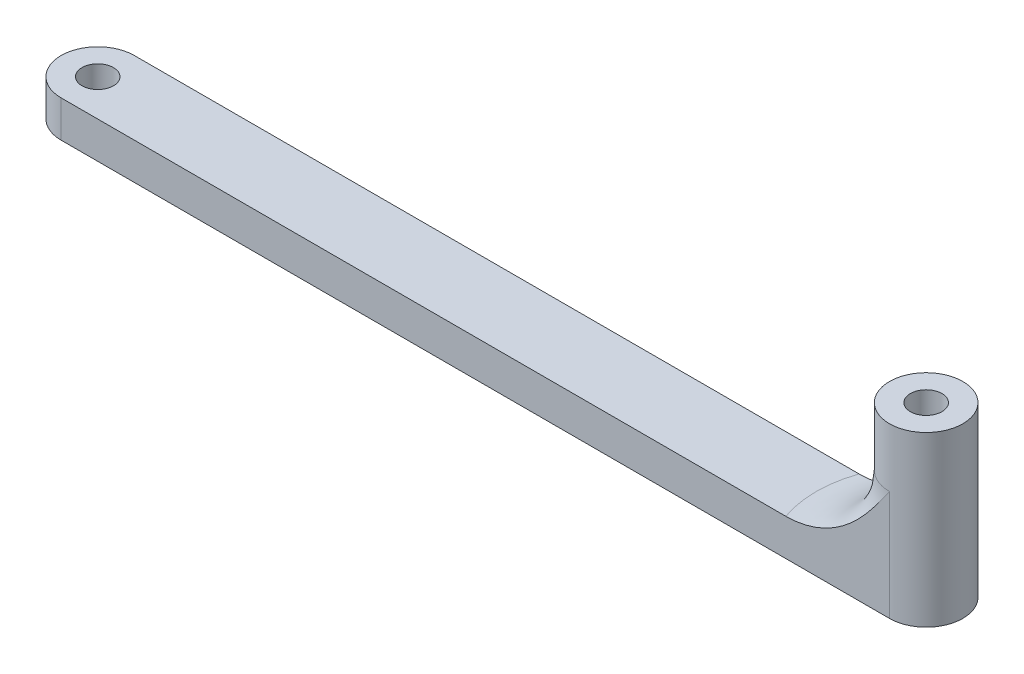
ISO-10303-21;
HEADER;
FILE_DESCRIPTION(('STEP AP214'),'2;1');
FILE_NAME('part.step','',(''),(''),'','','');
FILE_SCHEMA(('AUTOMOTIVE_DESIGN { 1 0 10303 214 1 1 1 1 }'));
ENDSEC;
DATA;
#1=APPLICATION_CONTEXT('core data for automotive mechanical design processes');
#2=APPLICATION_PROTOCOL_DEFINITION('international standard','automotive_design',2000,#1);
#3=PRODUCT_CONTEXT('',#1,'mechanical');
#4=PRODUCT('Part','Part','',(#3));
#5=PRODUCT_RELATED_PRODUCT_CATEGORY('part','',(#4));
#6=PRODUCT_DEFINITION_FORMATION('','',#4);
#7=PRODUCT_DEFINITION_CONTEXT('part definition',#1,'design');
#8=PRODUCT_DEFINITION('design','',#6,#7);
#9=PRODUCT_DEFINITION_SHAPE('','',#8);
#10=(LENGTH_UNIT() NAMED_UNIT(*) SI_UNIT(.MILLI.,.METRE.));
#11=(NAMED_UNIT(*) PLANE_ANGLE_UNIT() SI_UNIT($,.RADIAN.));
#12=(NAMED_UNIT(*) SI_UNIT($,.STERADIAN.) SOLID_ANGLE_UNIT());
#13=UNCERTAINTY_MEASURE_WITH_UNIT(LENGTH_MEASURE(1.E-05),#10,'distance_accuracy_value','');
#14=(GEOMETRIC_REPRESENTATION_CONTEXT(3) GLOBAL_UNCERTAINTY_ASSIGNED_CONTEXT((#13)) GLOBAL_UNIT_ASSIGNED_CONTEXT((#10,
#11,#12)) REPRESENTATION_CONTEXT('',''));
#15=CARTESIAN_POINT('',(0.,0.,0.));
#16=DIRECTION('',(0.,0.,1.));
#17=DIRECTION('',(1.,0.,0.));
#18=AXIS2_PLACEMENT_3D('',#15,#16,#17);
#19=CARTESIAN_POINT('',(-113.,5.,0.));
#20=DIRECTION('',(0.,1.,0.));
#21=DIRECTION('',(0.,0.,1.));
#22=AXIS2_PLACEMENT_3D('',#19,#20,#21);
#23=PLANE('',#22);
#24=CARTESIAN_POINT('',(-113.,5.,0.));
#25=DIRECTION('',(0.,1.,0.));
#26=DIRECTION('',(0.,0.,1.));
#27=AXIS2_PLACEMENT_3D('',#24,#25,#26);
#28=CIRCLE('',#27,2.15);
#29=CARTESIAN_POINT('',(-113.,5.,2.15));
#30=VERTEX_POINT('',#29);
#31=EDGE_CURVE('E179',#30,#30,#28,.F.);
#32=ORIENTED_EDGE('',*,*,#31,.T.);
#33=EDGE_LOOP('',(#32));
#34=FACE_BOUND('',#33,.T.);
#35=DIRECTION('',(1.,0.,0.));
#36=VECTOR('',#35,1.);
#37=CARTESIAN_POINT('',(0.,5.,5.));
#38=LINE('',#37,#36);
#39=CARTESIAN_POINT('',(-113.,5.,5.00000000000001));
#40=VERTEX_POINT('',#39);
#41=CARTESIAN_POINT('',(-14.1421356237309,5.,5.));
#42=VERTEX_POINT('',#41);
#43=EDGE_CURVE('E93',#40,#42,#38,.T.);
#44=ORIENTED_EDGE('',*,*,#43,.T.);
#45=CARTESIAN_POINT('',(0.,5.,0.));
#46=DIRECTION('',(0.,1.,0.));
#47=DIRECTION('',(0.,0.,1.));
#48=AXIS2_PLACEMENT_3D('',#45,#46,#47);
#49=CIRCLE('',#48,15.);
#50=CARTESIAN_POINT('',(-14.1421356237309,5.,-4.99999999999999));
#51=VERTEX_POINT('',#50);
#52=EDGE_CURVE('E119',#42,#51,#49,.F.);
#53=ORIENTED_EDGE('',*,*,#52,.T.);
#54=DIRECTION('',(-1.,0.,0.));
#55=VECTOR('',#54,1.);
#56=CARTESIAN_POINT('',(-113.,5.,-4.99999999999999));
#57=LINE('',#56,#55);
#58=CARTESIAN_POINT('',(-113.,5.,-4.99999999999999));
#59=VERTEX_POINT('',#58);
#60=EDGE_CURVE('E104',#51,#59,#57,.T.);
#61=ORIENTED_EDGE('',*,*,#60,.T.);
#62=CARTESIAN_POINT('',(-113.,5.,0.));
#63=DIRECTION('',(0.,1.,0.));
#64=DIRECTION('',(0.,0.,1.));
#65=AXIS2_PLACEMENT_3D('',#62,#63,#64);
#66=CIRCLE('',#65,5.);
#67=EDGE_CURVE('E105',#59,#40,#66,.T.);
#68=ORIENTED_EDGE('',*,*,#67,.T.);
#69=EDGE_LOOP('',(#44,#53,#61,#68));
#70=FACE_BOUND('',#69,.T.);
#71=ADVANCED_FACE('F45',(#34,#70),#23,.T.);
#72=CARTESIAN_POINT('',(-113.,5.,0.));
#73=DIRECTION('',(0.,-1.,0.));
#74=DIRECTION('',(0.,0.,-1.));
#75=AXIS2_PLACEMENT_3D('',#72,#73,#74);
#76=CYLINDRICAL_SURFACE('',#75,5.);
#77=CARTESIAN_POINT('',(-113.,0.,0.));
#78=DIRECTION('',(0.,1.,0.));
#79=DIRECTION('',(0.,0.,1.));
#80=AXIS2_PLACEMENT_3D('',#77,#78,#79);
#81=CIRCLE('',#80,5.);
#82=CARTESIAN_POINT('',(-113.,0.,-4.99999999999999));
#83=VERTEX_POINT('',#82);
#84=CARTESIAN_POINT('',(-113.,0.,5.00000000000001));
#85=VERTEX_POINT('',#84);
#86=EDGE_CURVE('E117',#83,#85,#81,.T.);
#87=ORIENTED_EDGE('',*,*,#86,.T.);
#88=DIRECTION('',(0.,-1.,0.));
#89=VECTOR('',#88,1.);
#90=CARTESIAN_POINT('',(-113.,5.,5.00000000000001));
#91=LINE('',#90,#89);
#92=EDGE_CURVE('E97',#40,#85,#91,.T.);
#93=ORIENTED_EDGE('',*,*,#92,.F.);
#94=ORIENTED_EDGE('',*,*,#67,.F.);
#95=DIRECTION('',(0.,-1.,0.));
#96=VECTOR('',#95,1.);
#97=CARTESIAN_POINT('',(-113.,5.,-4.99999999999999));
#98=LINE('',#97,#96);
#99=EDGE_CURVE('E201',#59,#83,#98,.T.);
#100=ORIENTED_EDGE('',*,*,#99,.T.);
#101=EDGE_LOOP('',(#87,#93,#94,#100));
#102=FACE_BOUND('',#101,.T.);
#103=ADVANCED_FACE('F115',(#102),#76,.T.);
#104=CARTESIAN_POINT('',(0.,5.,5.));
#105=DIRECTION('',(0.,0.,-1.));
#106=DIRECTION('',(-1.,0.,0.));
#107=AXIS2_PLACEMENT_3D('',#104,#105,#106);
#108=PLANE('',#107);
#109=DIRECTION('',(1.,0.,0.));
#110=VECTOR('',#109,1.);
#111=CARTESIAN_POINT('',(0.,0.,5.));
#112=LINE('',#111,#110);
#113=CARTESIAN_POINT('',(0.,0.,5.));
#114=VERTEX_POINT('',#113);
#115=EDGE_CURVE('E204',#85,#114,#112,.T.);
#116=ORIENTED_EDGE('',*,*,#115,.T.);
#117=DIRECTION('',(0.,-1.,0.));
#118=VECTOR('',#117,1.);
#119=CARTESIAN_POINT('',(0.,5.,5.));
#120=LINE('',#119,#118);
#121=CARTESIAN_POINT('',(0.,15.,5.));
#122=VERTEX_POINT('',#121);
#123=EDGE_CURVE('E70',#122,#114,#120,.T.);
#124=ORIENTED_EDGE('',*,*,#123,.F.);
#125=CARTESIAN_POINT('',(-14.1421356237309,5.,5.));
#126=CARTESIAN_POINT('',(-13.8230051879696,4.99995634355552,5.));
#127=CARTESIAN_POINT('',(-13.5039428919678,5.01357552377008,5.));
#128=CARTESIAN_POINT('',(-12.8682305116308,5.06718668231341,5.));
#129=CARTESIAN_POINT('',(-12.5515790542246,5.10716230234532,5.));
#130=CARTESIAN_POINT('',(-11.9242008380872,5.21226143054451,5.));
#131=CARTESIAN_POINT('',(-11.6134518161634,5.27725292333295,5.));
#132=CARTESIAN_POINT('',(-10.9979217766346,5.43120992465843,5.));
#133=CARTESIAN_POINT('',(-10.6931417086581,5.52017921522785,5.));
#134=CARTESIAN_POINT('',(-10.0772931474823,5.7253449852507,5.));
#135=CARTESIAN_POINT('',(-9.76657958710524,5.8426050307139,5.));
#136=CARTESIAN_POINT('',(-9.1548807479351,6.10013114474688,5.));
#137=CARTESIAN_POINT('',(-8.85389532497808,6.24039687220186,5.));
#138=CARTESIAN_POINT('',(-8.26248166629449,6.54221535394646,5.));
#139=CARTESIAN_POINT('',(-7.97206309022629,6.70378699065936,5.));
#140=CARTESIAN_POINT('',(-7.40277395801642,7.04618282283064,5.));
#141=CARTESIAN_POINT('',(-7.12390627178171,7.22701176353145,5.));
#142=CARTESIAN_POINT('',(-6.40248494240149,7.72792623310027,5.));
#143=CARTESIAN_POINT('',(-5.97009523344623,8.06273446381213,5.));
#144=CARTESIAN_POINT('',(-5.13745689692066,8.77019126426365,5.));
#145=CARTESIAN_POINT('',(-4.73722856808455,9.14286340112744,5.));
#146=CARTESIAN_POINT('',(-3.96562272092432,9.91815554780315,5.));
#147=CARTESIAN_POINT('',(-3.59430300296987,10.3208325570778,5.));
#148=CARTESIAN_POINT('',(-2.8766276596512,11.1474834327429,5.));
#149=CARTESIAN_POINT('',(-2.53026752543308,11.5714534290356,5.));
#150=CARTESIAN_POINT('',(-2.00334909313719,12.2450704742527,5.));
#151=CARTESIAN_POINT('',(-1.81651442896515,12.4898813857634,5.));
#152=CARTESIAN_POINT('',(-1.44751596392262,12.9825326491266,5.));
#153=CARTESIAN_POINT('',(-1.26534674340808,13.2303689413088,5.));
#154=CARTESIAN_POINT('',(-0.722897389219554,13.9778248692997,5.00000000000001));
#155=CARTESIAN_POINT('',(-0.36717879391779,14.4807324426141,5.00000000000003));
#156=CARTESIAN_POINT('',(-0.00769800108332774,14.9891133808673,5.));
#157=CARTESIAN_POINT('',(-0.00384899925391895,14.9945566914306,5.));
#158=CARTESIAN_POINT('',(0.,15.,5.));
#159=B_SPLINE_CURVE_WITH_KNOTS('',3,(#125,#126,#127,#128,#129,#130,#131,#132,#133,#134,#135,
#136,#137,#138,#139,#140,#141,#142,#143,#144,#145,#146,#147,#148,#149,#150,#151,#152,#153,#154,
#155,#156,#157,#158),.UNSPECIFIED.,.F.,.F.,(4,2,2,2,2,2,2,2,2,2,2,2,2,2,2,2,4),(0.,
0.957000180660541,1.91340695133456,2.86483421804859,3.81641164187218,4.81173036618114,
5.80703433381977,6.80322639646036,7.79966450387482,9.43740698975285,11.0761751521246,
12.7181399589232,14.3598074035813,15.2836469331366,16.2063595372522,18.0542715778394,
18.0742715778394),.UNSPECIFIED.);
#160=EDGE_CURVE('E11',#122,#42,#159,.F.);
#161=ORIENTED_EDGE('',*,*,#160,.T.);
#162=ORIENTED_EDGE('',*,*,#43,.F.);
#163=ORIENTED_EDGE('',*,*,#92,.T.);
#164=EDGE_LOOP('',(#116,#124,#161,#162,#163));
#165=FACE_BOUND('',#164,.T.);
#166=ADVANCED_FACE('F95',(#165),#108,.F.);
#167=CARTESIAN_POINT('',(0.,5.,0.));
#168=DIRECTION('',(0.,-1.,0.));
#169=DIRECTION('',(0.,0.,-1.));
#170=AXIS2_PLACEMENT_3D('',#167,#168,#169);
#171=CYLINDRICAL_SURFACE('',#170,4.99999999999999);
#172=DIRECTION('',(0.,-1.,0.));
#173=VECTOR('',#172,1.);
#174=CARTESIAN_POINT('',(0.,5.,-4.99999999999999));
#175=LINE('',#174,#173);
#176=CARTESIAN_POINT('',(0.,15.,-4.99999999999999));
#177=VERTEX_POINT('',#176);
#178=CARTESIAN_POINT('',(0.,0.,-4.99999999999999));
#179=VERTEX_POINT('',#178);
#180=EDGE_CURVE('E63',#177,#179,#175,.T.);
#181=ORIENTED_EDGE('',*,*,#180,.F.);
#182=CARTESIAN_POINT('',(0.,15.,0.));
#183=DIRECTION('',(0.,1.,0.));
#184=DIRECTION('',(0.,0.,1.));
#185=AXIS2_PLACEMENT_3D('',#182,#183,#184);
#186=CIRCLE('',#185,4.99999999999999);
#187=EDGE_CURVE('E123',#177,#122,#186,.T.);
#188=ORIENTED_EDGE('',*,*,#187,.T.);
#189=ORIENTED_EDGE('',*,*,#123,.T.);
#190=CARTESIAN_POINT('',(0.,0.,0.));
#191=DIRECTION('',(0.,1.,0.));
#192=DIRECTION('',(0.,0.,-1.));
#193=AXIS2_PLACEMENT_3D('',#190,#191,#192);
#194=CIRCLE('',#193,4.99999999999999);
#195=EDGE_CURVE('E207',#114,#179,#194,.T.);
#196=ORIENTED_EDGE('',*,*,#195,.T.);
#197=EDGE_LOOP('',(#181,#188,#189,#196));
#198=FACE_BOUND('',#197,.T.);
#199=CARTESIAN_POINT('',(0.,23.,0.));
#200=DIRECTION('',(0.,1.,0.));
#201=DIRECTION('',(0.,0.,1.));
#202=AXIS2_PLACEMENT_3D('',#199,#200,#201);
#203=CIRCLE('',#202,4.99999999999999);
#204=CARTESIAN_POINT('',(0.,23.,4.99999999999999));
#205=VERTEX_POINT('',#204);
#206=EDGE_CURVE('E195',#205,#205,#203,.T.);
#207=ORIENTED_EDGE('',*,*,#206,.F.);
#208=EDGE_LOOP('',(#207));
#209=FACE_BOUND('',#208,.T.);
#210=ADVANCED_FACE('F147',(#198,#209),#171,.T.);
#211=CARTESIAN_POINT('',(-113.,5.,-4.99999999999999));
#212=DIRECTION('',(0.,0.,1.));
#213=DIRECTION('',(1.,0.,0.));
#214=AXIS2_PLACEMENT_3D('',#211,#212,#213);
#215=PLANE('',#214);
#216=DIRECTION('',(-1.,0.,0.));
#217=VECTOR('',#216,1.);
#218=CARTESIAN_POINT('',(-113.,0.,-4.99999999999999));
#219=LINE('',#218,#217);
#220=EDGE_CURVE('E113',#179,#83,#219,.T.);
#221=ORIENTED_EDGE('',*,*,#220,.T.);
#222=ORIENTED_EDGE('',*,*,#99,.F.);
#223=ORIENTED_EDGE('',*,*,#60,.F.);
#224=CARTESIAN_POINT('',(-14.1421356237309,5.,-4.99999999999999));
#225=CARTESIAN_POINT('',(-13.8230051879696,4.99995634355552,-4.99999999999999));
#226=CARTESIAN_POINT('',(-13.5039428919678,5.01357552377008,-4.99999999999999));
#227=CARTESIAN_POINT('',(-12.8682305116308,5.06718668231341,-4.99999999999999));
#228=CARTESIAN_POINT('',(-12.5515790542246,5.10716230234532,-4.99999999999999));
#229=CARTESIAN_POINT('',(-11.9242008380872,5.21226143054452,-4.99999999999999));
#230=CARTESIAN_POINT('',(-11.6134518161634,5.27725292333295,-4.99999999999999));
#231=CARTESIAN_POINT('',(-10.9979217766346,5.43120992465843,-4.99999999999999));
#232=CARTESIAN_POINT('',(-10.6931417086581,5.52017921522785,-4.99999999999999));
#233=CARTESIAN_POINT('',(-10.0772931474823,5.7253449852507,-4.99999999999999));
#234=CARTESIAN_POINT('',(-9.76657958710524,5.8426050307139,-4.99999999999999));
#235=CARTESIAN_POINT('',(-9.1548807479351,6.10013114474688,-4.99999999999999));
#236=CARTESIAN_POINT('',(-8.85389532497808,6.24039687220185,-4.99999999999999));
#237=CARTESIAN_POINT('',(-8.26248166629449,6.54221535394646,-4.99999999999999));
#238=CARTESIAN_POINT('',(-7.97206309022629,6.70378699065936,-4.99999999999999));
#239=CARTESIAN_POINT('',(-7.40277395801643,7.04618282283064,-4.99999999999999));
#240=CARTESIAN_POINT('',(-7.12390627178171,7.22701176353145,-4.99999999999999));
#241=CARTESIAN_POINT('',(-6.40248494240149,7.72792623310026,-4.99999999999999));
#242=CARTESIAN_POINT('',(-5.97009523344623,8.06273446381213,-4.99999999999999));
#243=CARTESIAN_POINT('',(-5.13745689692066,8.77019126426365,-4.99999999999999));
#244=CARTESIAN_POINT('',(-4.73722856808455,9.14286340112744,-4.99999999999999));
#245=CARTESIAN_POINT('',(-3.96562272092432,9.91815554780315,-4.99999999999999));
#246=CARTESIAN_POINT('',(-3.59430300296987,10.3208325570778,-4.99999999999999));
#247=CARTESIAN_POINT('',(-2.87662765965121,11.1474834327429,-4.99999999999999));
#248=CARTESIAN_POINT('',(-2.53026752543309,11.5714534290356,-4.99999999999999));
#249=CARTESIAN_POINT('',(-2.0033490931372,12.2450704742527,-4.99999999999999));
#250=CARTESIAN_POINT('',(-1.81651442896515,12.4898813857633,-4.99999999999999));
#251=CARTESIAN_POINT('',(-1.44751596392264,12.9825326491266,-4.99999999999999));
#252=CARTESIAN_POINT('',(-1.26534674340811,13.2303689413088,-4.99999999999998));
#253=CARTESIAN_POINT('',(-0.722897389219524,13.9778248692997,-4.99999999999999));
#254=CARTESIAN_POINT('',(-0.367178793917549,14.480732442614,-5.00000000000001));
#255=CARTESIAN_POINT('',(-0.00769800108332215,14.9891133808673,-4.99999999999999));
#256=CARTESIAN_POINT('',(-0.00384899925391644,14.9945566914306,-4.99999999999999));
#257=CARTESIAN_POINT('',(0.,15.,-4.99999999999999));
#258=B_SPLINE_CURVE_WITH_KNOTS('',3,(#224,#225,#226,#227,#228,#229,#230,#231,#232,#233,#234,
#235,#236,#237,#238,#239,#240,#241,#242,#243,#244,#245,#246,#247,#248,#249,#250,#251,#252,#253,
#254,#255,#256,#257),.UNSPECIFIED.,.F.,.F.,(4,2,2,2,2,2,2,2,2,2,2,2,2,2,2,2,4),(0.,
0.957000180660546,1.91340695133457,2.8648342180486,3.81641164187217,4.81173036618114,
5.80703433381976,6.80322639646036,7.79966450387481,9.43740698975285,11.0761751521246,
12.7181399589231,14.3598074035812,15.2836469331366,16.2063595372522,18.0542715778394,
18.0742715778394),.UNSPECIFIED.);
#259=EDGE_CURVE('E56',#51,#177,#258,.T.);
#260=ORIENTED_EDGE('',*,*,#259,.T.);
#261=ORIENTED_EDGE('',*,*,#180,.T.);
#262=EDGE_LOOP('',(#221,#222,#223,#260,#261));
#263=FACE_BOUND('',#262,.T.);
#264=ADVANCED_FACE('F141',(#263),#215,.F.);
#265=CARTESIAN_POINT('',(-113.,0.,0.));
#266=DIRECTION('',(0.,1.,0.));
#267=DIRECTION('',(0.,0.,1.));
#268=AXIS2_PLACEMENT_3D('',#265,#266,#267);
#269=PLANE('',#268);
#270=CARTESIAN_POINT('',(-113.,0.,0.));
#271=DIRECTION('',(0.,1.,0.));
#272=DIRECTION('',(0.,0.,1.));
#273=AXIS2_PLACEMENT_3D('',#270,#271,#272);
#274=CIRCLE('',#273,2.15);
#275=CARTESIAN_POINT('',(-113.,0.,2.15));
#276=VERTEX_POINT('',#275);
#277=EDGE_CURVE('E182',#276,#276,#274,.T.);
#278=ORIENTED_EDGE('',*,*,#277,.T.);
#279=EDGE_LOOP('',(#278));
#280=FACE_BOUND('',#279,.T.);
#281=CARTESIAN_POINT('',(0.,0.,0.));
#282=DIRECTION('',(0.,1.,0.));
#283=DIRECTION('',(0.,0.,1.));
#284=AXIS2_PLACEMENT_3D('',#281,#282,#283);
#285=CIRCLE('',#284,2.15);
#286=CARTESIAN_POINT('',(0.,0.,2.15));
#287=VERTEX_POINT('',#286);
#288=EDGE_CURVE('E185',#287,#287,#285,.T.);
#289=ORIENTED_EDGE('',*,*,#288,.T.);
#290=EDGE_LOOP('',(#289));
#291=FACE_BOUND('',#290,.T.);
#292=ORIENTED_EDGE('',*,*,#195,.F.);
#293=ORIENTED_EDGE('',*,*,#115,.F.);
#294=ORIENTED_EDGE('',*,*,#86,.F.);
#295=ORIENTED_EDGE('',*,*,#220,.F.);
#296=EDGE_LOOP('',(#292,#293,#294,#295));
#297=FACE_BOUND('',#296,.T.);
#298=ADVANCED_FACE('F146',(#280,#291,#297),#269,.F.);
#299=CARTESIAN_POINT('',(0.,23.,0.));
#300=DIRECTION('',(0.,1.,0.));
#301=DIRECTION('',(0.,0.,1.));
#302=AXIS2_PLACEMENT_3D('',#299,#300,#301);
#303=PLANE('',#302);
#304=CARTESIAN_POINT('',(0.,23.,0.));
#305=DIRECTION('',(0.,1.,0.));
#306=DIRECTION('',(0.,0.,1.));
#307=AXIS2_PLACEMENT_3D('',#304,#305,#306);
#308=CIRCLE('',#307,2.15);
#309=CARTESIAN_POINT('',(0.,23.,2.15));
#310=VERTEX_POINT('',#309);
#311=EDGE_CURVE('E50',#310,#310,#308,.F.);
#312=ORIENTED_EDGE('',*,*,#311,.T.);
#313=EDGE_LOOP('',(#312));
#314=FACE_BOUND('',#313,.T.);
#315=ORIENTED_EDGE('',*,*,#206,.T.);
#316=EDGE_LOOP('',(#315));
#317=FACE_BOUND('',#316,.T.);
#318=ADVANCED_FACE('F164',(#314,#317),#303,.T.);
#319=CARTESIAN_POINT('',(0.,15.,0.));
#320=DIRECTION('',(0.,1.,0.));
#321=DIRECTION('',(0.,0.,1.));
#322=AXIS2_PLACEMENT_3D('',#319,#320,#321);
#323=TOROIDAL_SURFACE('',#322,15.,10.);
#324=ORIENTED_EDGE('',*,*,#160,.F.);
#325=ORIENTED_EDGE('',*,*,#187,.F.);
#326=ORIENTED_EDGE('',*,*,#259,.F.);
#327=ORIENTED_EDGE('',*,*,#52,.F.);
#328=EDGE_LOOP('',(#324,#325,#326,#327));
#329=FACE_BOUND('',#328,.T.);
#330=ADVANCED_FACE('F47',(#329),#323,.F.);
#331=CARTESIAN_POINT('',(0.,30.,0.));
#332=DIRECTION('',(0.,-1.,0.));
#333=DIRECTION('',(0.,0.,-1.));
#334=AXIS2_PLACEMENT_3D('',#331,#332,#333);
#335=CYLINDRICAL_SURFACE('',#334,2.15);
#336=ORIENTED_EDGE('',*,*,#311,.F.);
#337=EDGE_LOOP('',(#336));
#338=FACE_BOUND('',#337,.T.);
#339=ORIENTED_EDGE('',*,*,#288,.F.);
#340=EDGE_LOOP('',(#339));
#341=FACE_BOUND('',#340,.T.);
#342=ADVANCED_FACE('F168',(#338,#341),#335,.F.);
#343=CARTESIAN_POINT('',(-113.,30.,0.));
#344=DIRECTION('',(0.,-1.,0.));
#345=DIRECTION('',(0.,0.,-1.));
#346=AXIS2_PLACEMENT_3D('',#343,#344,#345);
#347=CYLINDRICAL_SURFACE('',#346,2.15);
#348=ORIENTED_EDGE('',*,*,#31,.F.);
#349=EDGE_LOOP('',(#348));
#350=FACE_BOUND('',#349,.T.);
#351=ORIENTED_EDGE('',*,*,#277,.F.);
#352=EDGE_LOOP('',(#351));
#353=FACE_BOUND('',#352,.T.);
#354=ADVANCED_FACE('F171',(#350,#353),#347,.F.);
#355=CLOSED_SHELL('',(#71,#103,#166,#210,#264,#298,#318,#330,#342,#354));
#356=MANIFOLD_SOLID_BREP('B2',#355);
#357=ADVANCED_BREP_SHAPE_REPRESENTATION('',(#18,#356),#14);
#358=SHAPE_DEFINITION_REPRESENTATION(#9,#357);
ENDSEC;
END-ISO-10303-21;
